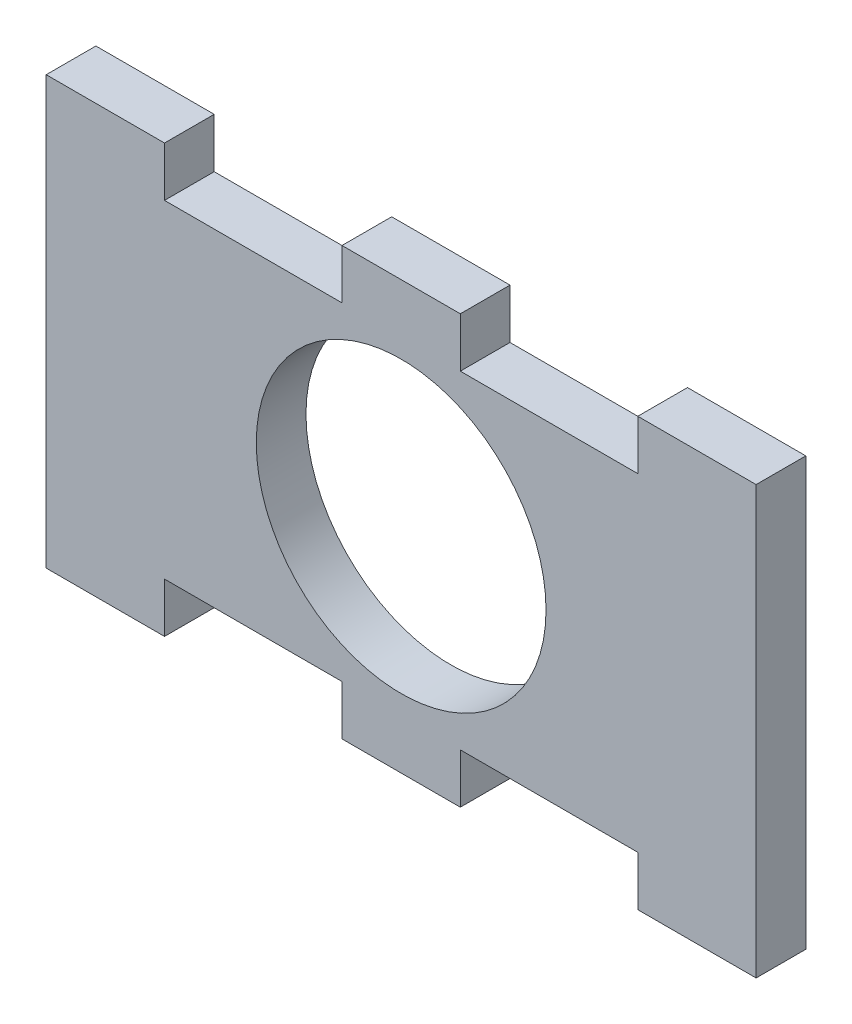
ISO-10303-21;
HEADER;
FILE_DESCRIPTION(('STEP AP214'),'2;1');
FILE_NAME('part.step','',(''),(''),'','','');
FILE_SCHEMA(('AUTOMOTIVE_DESIGN { 1 0 10303 214 1 1 1 1 }'));
ENDSEC;
DATA;
#1=APPLICATION_CONTEXT('core data for automotive mechanical design processes');
#2=APPLICATION_PROTOCOL_DEFINITION('international standard','automotive_design',2000,#1);
#3=PRODUCT_CONTEXT('',#1,'mechanical');
#4=PRODUCT('Part','Part','',(#3));
#5=PRODUCT_RELATED_PRODUCT_CATEGORY('part','',(#4));
#6=PRODUCT_DEFINITION_FORMATION('','',#4);
#7=PRODUCT_DEFINITION_CONTEXT('part definition',#1,'design');
#8=PRODUCT_DEFINITION('design','',#6,#7);
#9=PRODUCT_DEFINITION_SHAPE('','',#8);
#10=(LENGTH_UNIT() NAMED_UNIT(*) SI_UNIT(.MILLI.,.METRE.));
#11=(NAMED_UNIT(*) PLANE_ANGLE_UNIT() SI_UNIT($,.RADIAN.));
#12=(NAMED_UNIT(*) SI_UNIT($,.STERADIAN.) SOLID_ANGLE_UNIT());
#13=UNCERTAINTY_MEASURE_WITH_UNIT(LENGTH_MEASURE(1.E-05),#10,'distance_accuracy_value','');
#14=(GEOMETRIC_REPRESENTATION_CONTEXT(3) GLOBAL_UNCERTAINTY_ASSIGNED_CONTEXT((#13)) GLOBAL_UNIT_ASSIGNED_CONTEXT((#10,
#11,#12)) REPRESENTATION_CONTEXT('',''));
#15=CARTESIAN_POINT('',(0.,0.,0.));
#16=DIRECTION('',(0.,0.,1.));
#17=DIRECTION('',(1.,0.,0.));
#18=AXIS2_PLACEMENT_3D('',#15,#16,#17);
#19=CARTESIAN_POINT('',(-38.1,-17.6,-5.334));
#20=DIRECTION('',(0.,-1.,0.));
#21=DIRECTION('',(0.,0.,-1.));
#22=AXIS2_PLACEMENT_3D('',#19,#20,#21);
#23=PLANE('',#22);
#24=DIRECTION('',(1.,0.,0.));
#25=VECTOR('',#24,1.);
#26=CARTESIAN_POINT('',(-38.1,-17.6,-5.334));
#27=LINE('',#26,#25);
#28=CARTESIAN_POINT('',(6.35,-17.6,-5.334));
#29=VERTEX_POINT('',#28);
#30=CARTESIAN_POINT('',(25.4,-17.6,-5.334));
#31=VERTEX_POINT('',#30);
#32=EDGE_CURVE('E49',#29,#31,#27,.T.);
#33=ORIENTED_EDGE('',*,*,#32,.T.);
#34=DIRECTION('',(0.,0.,-1.));
#35=VECTOR('',#34,1.);
#36=CARTESIAN_POINT('',(25.4,-17.6,0.));
#37=LINE('',#36,#35);
#38=CARTESIAN_POINT('',(25.4,-17.6,0.));
#39=VERTEX_POINT('',#38);
#40=EDGE_CURVE('E204',#39,#31,#37,.T.);
#41=ORIENTED_EDGE('',*,*,#40,.F.);
#42=DIRECTION('',(1.,0.,0.));
#43=VECTOR('',#42,1.);
#44=CARTESIAN_POINT('',(-38.1,-17.6,0.));
#45=LINE('',#44,#43);
#46=CARTESIAN_POINT('',(6.35,-17.6,0.));
#47=VERTEX_POINT('',#46);
#48=EDGE_CURVE('E208',#47,#39,#45,.T.);
#49=ORIENTED_EDGE('',*,*,#48,.F.);
#50=DIRECTION('',(0.,0.,1.));
#51=VECTOR('',#50,1.);
#52=CARTESIAN_POINT('',(6.35,-17.6,0.));
#53=LINE('',#52,#51);
#54=EDGE_CURVE('E212',#29,#47,#53,.T.);
#55=ORIENTED_EDGE('',*,*,#54,.F.);
#56=EDGE_LOOP('',(#33,#41,#49,#55));
#57=FACE_BOUND('',#56,.T.);
#58=ADVANCED_FACE('F45',(#57),#23,.T.);
#59=CARTESIAN_POINT('',(-25.4,-17.6,-5.334));
#60=VERTEX_POINT('',#59);
#61=CARTESIAN_POINT('',(-6.35,-17.6,-5.334));
#62=VERTEX_POINT('',#61);
#63=EDGE_CURVE('E13',#60,#62,#27,.T.);
#64=ORIENTED_EDGE('',*,*,#63,.T.);
#65=DIRECTION('',(0.,0.,-1.));
#66=VECTOR('',#65,1.);
#67=CARTESIAN_POINT('',(-6.35,-17.6,0.));
#68=LINE('',#67,#66);
#69=CARTESIAN_POINT('',(-6.35,-17.6,0.));
#70=VERTEX_POINT('',#69);
#71=EDGE_CURVE('E209',#70,#62,#68,.T.);
#72=ORIENTED_EDGE('',*,*,#71,.F.);
#73=CARTESIAN_POINT('',(-25.4,-17.6,0.));
#74=VERTEX_POINT('',#73);
#75=EDGE_CURVE('E262',#74,#70,#45,.T.);
#76=ORIENTED_EDGE('',*,*,#75,.F.);
#77=DIRECTION('',(0.,0.,1.));
#78=VECTOR('',#77,1.);
#79=CARTESIAN_POINT('',(-25.4,-17.6,0.));
#80=LINE('',#79,#78);
#81=EDGE_CURVE('E69',#60,#74,#80,.T.);
#82=ORIENTED_EDGE('',*,*,#81,.F.);
#83=EDGE_LOOP('',(#64,#72,#76,#82));
#84=FACE_BOUND('',#83,.T.);
#85=ADVANCED_FACE('F394',(#84),#23,.T.);
#86=CARTESIAN_POINT('',(-38.1,17.6,-5.334));
#87=DIRECTION('',(0.,1.,0.));
#88=DIRECTION('',(0.,0.,1.));
#89=AXIS2_PLACEMENT_3D('',#86,#87,#88);
#90=PLANE('',#89);
#91=DIRECTION('',(-1.,0.,0.));
#92=VECTOR('',#91,1.);
#93=CARTESIAN_POINT('',(-38.1,17.6,0.));
#94=LINE('',#93,#92);
#95=CARTESIAN_POINT('',(25.4,17.6,0.));
#96=VERTEX_POINT('',#95);
#97=CARTESIAN_POINT('',(6.35000000000002,17.6,0.));
#98=VERTEX_POINT('',#97);
#99=EDGE_CURVE('E280',#96,#98,#94,.T.);
#100=ORIENTED_EDGE('',*,*,#99,.F.);
#101=DIRECTION('',(0.,0.,1.));
#102=VECTOR('',#101,1.);
#103=CARTESIAN_POINT('',(25.4,17.6,-5.33400000000004));
#104=LINE('',#103,#102);
#105=CARTESIAN_POINT('',(25.4,17.6,-5.33400000000004));
#106=VERTEX_POINT('',#105);
#107=EDGE_CURVE('E259',#106,#96,#104,.T.);
#108=ORIENTED_EDGE('',*,*,#107,.F.);
#109=DIRECTION('',(-1.,0.,0.));
#110=VECTOR('',#109,1.);
#111=CARTESIAN_POINT('',(-38.1,17.6,-5.334));
#112=LINE('',#111,#110);
#113=CARTESIAN_POINT('',(6.35000000000001,17.6,-5.33400000000002));
#114=VERTEX_POINT('',#113);
#115=EDGE_CURVE('E275',#106,#114,#112,.T.);
#116=ORIENTED_EDGE('',*,*,#115,.T.);
#117=DIRECTION('',(0.,0.,-1.));
#118=VECTOR('',#117,1.);
#119=CARTESIAN_POINT('',(6.35000000000001,17.6,-5.33400000000002));
#120=LINE('',#119,#118);
#121=EDGE_CURVE('E333',#98,#114,#120,.T.);
#122=ORIENTED_EDGE('',*,*,#121,.F.);
#123=EDGE_LOOP('',(#100,#108,#116,#122));
#124=FACE_BOUND('',#123,.T.);
#125=ADVANCED_FACE('F372',(#124),#90,.T.);
#126=CARTESIAN_POINT('',(-6.35000000000002,17.6,0.));
#127=VERTEX_POINT('',#126);
#128=CARTESIAN_POINT('',(-25.4,17.6,0.));
#129=VERTEX_POINT('',#128);
#130=EDGE_CURVE('E288',#127,#129,#94,.T.);
#131=ORIENTED_EDGE('',*,*,#130,.F.);
#132=DIRECTION('',(0.,0.,1.));
#133=VECTOR('',#132,1.);
#134=CARTESIAN_POINT('',(-6.35,17.6,-5.33400000000001));
#135=LINE('',#134,#133);
#136=CARTESIAN_POINT('',(-6.35,17.6,-5.33400000000001));
#137=VERTEX_POINT('',#136);
#138=EDGE_CURVE('E337',#137,#127,#135,.T.);
#139=ORIENTED_EDGE('',*,*,#138,.F.);
#140=CARTESIAN_POINT('',(-25.4,17.6,-5.334));
#141=VERTEX_POINT('',#140);
#142=EDGE_CURVE('E279',#137,#141,#112,.T.);
#143=ORIENTED_EDGE('',*,*,#142,.T.);
#144=DIRECTION('',(0.,0.,-1.));
#145=VECTOR('',#144,1.);
#146=CARTESIAN_POINT('',(-25.4,17.6,-5.334));
#147=LINE('',#146,#145);
#148=EDGE_CURVE('E268',#129,#141,#147,.T.);
#149=ORIENTED_EDGE('',*,*,#148,.F.);
#150=EDGE_LOOP('',(#131,#139,#143,#149));
#151=FACE_BOUND('',#150,.T.);
#152=ADVANCED_FACE('F412',(#151),#90,.T.);
#153=CARTESIAN_POINT('',(38.1,17.6,-5.334));
#154=DIRECTION('',(1.,0.,0.));
#155=DIRECTION('',(0.,0.,-1.));
#156=AXIS2_PLACEMENT_3D('',#153,#154,#155);
#157=PLANE('',#156);
#158=DIRECTION('',(0.,1.,0.));
#159=VECTOR('',#158,1.);
#160=CARTESIAN_POINT('',(38.1,17.6,0.));
#161=LINE('',#160,#159);
#162=CARTESIAN_POINT('',(38.1,-22.934,0.));
#163=VERTEX_POINT('',#162);
#164=CARTESIAN_POINT('',(38.1,22.934,0.));
#165=VERTEX_POINT('',#164);
#166=EDGE_CURVE('E290',#163,#165,#161,.T.);
#167=ORIENTED_EDGE('',*,*,#166,.F.);
#168=DIRECTION('',(0.,0.,1.));
#169=VECTOR('',#168,1.);
#170=CARTESIAN_POINT('',(38.1,-22.934,0.));
#171=LINE('',#170,#169);
#172=CARTESIAN_POINT('',(38.1,-22.934,-5.334));
#173=VERTEX_POINT('',#172);
#174=EDGE_CURVE('E203',#173,#163,#171,.T.);
#175=ORIENTED_EDGE('',*,*,#174,.F.);
#176=DIRECTION('',(0.,1.,0.));
#177=VECTOR('',#176,1.);
#178=CARTESIAN_POINT('',(38.1,17.6,-5.334));
#179=LINE('',#178,#177);
#180=CARTESIAN_POINT('',(38.1,22.934,-5.33400000000006));
#181=VERTEX_POINT('',#180);
#182=EDGE_CURVE('E274',#173,#181,#179,.T.);
#183=ORIENTED_EDGE('',*,*,#182,.T.);
#184=DIRECTION('',(0.,0.,-1.));
#185=VECTOR('',#184,1.);
#186=CARTESIAN_POINT('',(38.1,22.934,-5.33400000000006));
#187=LINE('',#186,#185);
#188=EDGE_CURVE('E350',#165,#181,#187,.T.);
#189=ORIENTED_EDGE('',*,*,#188,.F.);
#190=EDGE_LOOP('',(#167,#175,#183,#189));
#191=FACE_BOUND('',#190,.T.);
#192=ADVANCED_FACE('F47',(#191),#157,.T.);
#193=CARTESIAN_POINT('',(-38.1,17.6,-5.334));
#194=DIRECTION('',(-1.,0.,0.));
#195=DIRECTION('',(0.,-1.,0.));
#196=AXIS2_PLACEMENT_3D('',#193,#194,#195);
#197=PLANE('',#196);
#198=DIRECTION('',(0.,-1.,0.));
#199=VECTOR('',#198,1.);
#200=CARTESIAN_POINT('',(-38.1,17.6,0.));
#201=LINE('',#200,#199);
#202=CARTESIAN_POINT('',(-38.1,22.934,0.));
#203=VERTEX_POINT('',#202);
#204=CARTESIAN_POINT('',(-38.1,-22.934,0.));
#205=VERTEX_POINT('',#204);
#206=EDGE_CURVE('E263',#203,#205,#201,.T.);
#207=ORIENTED_EDGE('',*,*,#206,.F.);
#208=DIRECTION('',(0.,0.,1.));
#209=VECTOR('',#208,1.);
#210=CARTESIAN_POINT('',(-38.1,22.934,-5.334));
#211=LINE('',#210,#209);
#212=CARTESIAN_POINT('',(-38.1,22.934,-5.334));
#213=VERTEX_POINT('',#212);
#214=EDGE_CURVE('E318',#213,#203,#211,.T.);
#215=ORIENTED_EDGE('',*,*,#214,.F.);
#216=DIRECTION('',(0.,-1.,0.));
#217=VECTOR('',#216,1.);
#218=CARTESIAN_POINT('',(-38.1,17.6,-5.334));
#219=LINE('',#218,#217);
#220=CARTESIAN_POINT('',(-38.1,-22.934,-5.334));
#221=VERTEX_POINT('',#220);
#222=EDGE_CURVE('E278',#213,#221,#219,.T.);
#223=ORIENTED_EDGE('',*,*,#222,.T.);
#224=DIRECTION('',(0.,0.,-1.));
#225=VECTOR('',#224,1.);
#226=CARTESIAN_POINT('',(-38.1,-22.934,0.));
#227=LINE('',#226,#225);
#228=EDGE_CURVE('E234',#205,#221,#227,.T.);
#229=ORIENTED_EDGE('',*,*,#228,.F.);
#230=EDGE_LOOP('',(#207,#215,#223,#229));
#231=FACE_BOUND('',#230,.T.);
#232=ADVANCED_FACE('F385',(#231),#197,.T.);
#233=CARTESIAN_POINT('',(0.,0.,-5.334));
#234=DIRECTION('',(0.,0.,1.));
#235=DIRECTION('',(1.,0.,0.));
#236=AXIS2_PLACEMENT_3D('',#233,#234,#235);
#237=PLANE('',#236);
#238=CARTESIAN_POINT('',(0.,0.,-5.334));
#239=DIRECTION('',(0.,0.,1.));
#240=DIRECTION('',(1.,0.,0.));
#241=AXIS2_PLACEMENT_3D('',#238,#239,#240);
#242=CIRCLE('',#241,15.55);
#243=CARTESIAN_POINT('',(15.55,0.,-5.334));
#244=VERTEX_POINT('',#243);
#245=EDGE_CURVE('E296',#244,#244,#242,.T.);
#246=ORIENTED_EDGE('',*,*,#245,.T.);
#247=EDGE_LOOP('',(#246));
#248=FACE_BOUND('',#247,.T.);
#249=ORIENTED_EDGE('',*,*,#182,.F.);
#250=DIRECTION('',(1.,0.,0.));
#251=VECTOR('',#250,1.);
#252=CARTESIAN_POINT('',(38.1,-22.934,-5.334));
#253=LINE('',#252,#251);
#254=CARTESIAN_POINT('',(25.4,-22.934,-5.334));
#255=VERTEX_POINT('',#254);
#256=EDGE_CURVE('E196',#255,#173,#253,.T.);
#257=ORIENTED_EDGE('',*,*,#256,.F.);
#258=DIRECTION('',(0.,1.,0.));
#259=VECTOR('',#258,1.);
#260=CARTESIAN_POINT('',(25.4,-22.934,-5.334));
#261=LINE('',#260,#259);
#262=EDGE_CURVE('E192',#255,#31,#261,.T.);
#263=ORIENTED_EDGE('',*,*,#262,.T.);
#264=ORIENTED_EDGE('',*,*,#32,.F.);
#265=DIRECTION('',(0.,1.,0.));
#266=VECTOR('',#265,1.);
#267=CARTESIAN_POINT('',(6.35,-22.934,-5.334));
#268=LINE('',#267,#266);
#269=CARTESIAN_POINT('',(6.35,-22.934,-5.334));
#270=VERTEX_POINT('',#269);
#271=EDGE_CURVE('E230',#270,#29,#268,.T.);
#272=ORIENTED_EDGE('',*,*,#271,.F.);
#273=DIRECTION('',(1.,0.,0.));
#274=VECTOR('',#273,1.);
#275=CARTESIAN_POINT('',(6.35,-22.934,-5.334));
#276=LINE('',#275,#274);
#277=CARTESIAN_POINT('',(-6.35,-22.934,-5.334));
#278=VERTEX_POINT('',#277);
#279=EDGE_CURVE('E220',#278,#270,#276,.T.);
#280=ORIENTED_EDGE('',*,*,#279,.F.);
#281=DIRECTION('',(0.,1.,0.));
#282=VECTOR('',#281,1.);
#283=CARTESIAN_POINT('',(-6.35,-22.934,-5.334));
#284=LINE('',#283,#282);
#285=EDGE_CURVE('E232',#278,#62,#284,.T.);
#286=ORIENTED_EDGE('',*,*,#285,.T.);
#287=ORIENTED_EDGE('',*,*,#63,.F.);
#288=DIRECTION('',(0.,1.,0.));
#289=VECTOR('',#288,1.);
#290=CARTESIAN_POINT('',(-25.4,-22.934,-5.334));
#291=LINE('',#290,#289);
#292=CARTESIAN_POINT('',(-25.4,-22.934,-5.334));
#293=VERTEX_POINT('',#292);
#294=EDGE_CURVE('E254',#293,#60,#291,.T.);
#295=ORIENTED_EDGE('',*,*,#294,.F.);
#296=DIRECTION('',(1.,0.,0.));
#297=VECTOR('',#296,1.);
#298=CARTESIAN_POINT('',(-38.1,-22.934,-5.334));
#299=LINE('',#298,#297);
#300=EDGE_CURVE('E237',#221,#293,#299,.T.);
#301=ORIENTED_EDGE('',*,*,#300,.F.);
#302=ORIENTED_EDGE('',*,*,#222,.F.);
#303=DIRECTION('',(-1.,0.,0.));
#304=VECTOR('',#303,1.);
#305=CARTESIAN_POINT('',(-38.1,22.934,-5.334));
#306=LINE('',#305,#304);
#307=CARTESIAN_POINT('',(-25.4,22.934,-5.334));
#308=VERTEX_POINT('',#307);
#309=EDGE_CURVE('E310',#308,#213,#306,.T.);
#310=ORIENTED_EDGE('',*,*,#309,.F.);
#311=DIRECTION('',(0.,-1.,0.));
#312=VECTOR('',#311,1.);
#313=CARTESIAN_POINT('',(-25.4,22.934,-5.334));
#314=LINE('',#313,#312);
#315=EDGE_CURVE('E313',#308,#141,#314,.T.);
#316=ORIENTED_EDGE('',*,*,#315,.T.);
#317=ORIENTED_EDGE('',*,*,#142,.F.);
#318=DIRECTION('',(0.,-1.,0.));
#319=VECTOR('',#318,1.);
#320=CARTESIAN_POINT('',(-6.35,22.934,-5.33400000000001));
#321=LINE('',#320,#319);
#322=CARTESIAN_POINT('',(-6.35,22.934,-5.33400000000001));
#323=VERTEX_POINT('',#322);
#324=EDGE_CURVE('E330',#323,#137,#321,.T.);
#325=ORIENTED_EDGE('',*,*,#324,.F.);
#326=DIRECTION('',(-1.,0.,0.));
#327=VECTOR('',#326,1.);
#328=CARTESIAN_POINT('',(6.35000000000001,22.934,-5.33400000000002));
#329=LINE('',#328,#327);
#330=CARTESIAN_POINT('',(6.35000000000001,22.934,-5.33400000000002));
#331=VERTEX_POINT('',#330);
#332=EDGE_CURVE('E332',#331,#323,#329,.T.);
#333=ORIENTED_EDGE('',*,*,#332,.F.);
#334=DIRECTION('',(0.,-1.,0.));
#335=VECTOR('',#334,1.);
#336=CARTESIAN_POINT('',(6.35000000000001,22.934,-5.33400000000002));
#337=LINE('',#336,#335);
#338=EDGE_CURVE('E327',#331,#114,#337,.T.);
#339=ORIENTED_EDGE('',*,*,#338,.T.);
#340=ORIENTED_EDGE('',*,*,#115,.F.);
#341=DIRECTION('',(0.,-1.,0.));
#342=VECTOR('',#341,1.);
#343=CARTESIAN_POINT('',(25.4,22.934,-5.33400000000004));
#344=LINE('',#343,#342);
#345=CARTESIAN_POINT('',(25.4,22.934,-5.33400000000004));
#346=VERTEX_POINT('',#345);
#347=EDGE_CURVE('E339',#346,#106,#344,.T.);
#348=ORIENTED_EDGE('',*,*,#347,.F.);
#349=DIRECTION('',(-1.,0.,0.));
#350=VECTOR('',#349,1.);
#351=CARTESIAN_POINT('',(38.1,22.934,-5.33400000000006));
#352=LINE('',#351,#350);
#353=EDGE_CURVE('E247',#181,#346,#352,.T.);
#354=ORIENTED_EDGE('',*,*,#353,.F.);
#355=EDGE_LOOP('',(#249,#257,#263,#264,#272,#280,#286,#287,#295,#301,#302,#310,#316,#317,#325,
#333,#339,#340,#348,#354));
#356=FACE_BOUND('',#355,.T.);
#357=ADVANCED_FACE('F366',(#248,#356),#237,.F.);
#358=CARTESIAN_POINT('',(0.,0.,0.));
#359=DIRECTION('',(0.,0.,1.));
#360=DIRECTION('',(1.,0.,0.));
#361=AXIS2_PLACEMENT_3D('',#358,#359,#360);
#362=PLANE('',#361);
#363=CARTESIAN_POINT('',(0.,0.,0.));
#364=DIRECTION('',(0.,0.,1.));
#365=DIRECTION('',(1.,0.,0.));
#366=AXIS2_PLACEMENT_3D('',#363,#364,#365);
#367=CIRCLE('',#366,15.55);
#368=CARTESIAN_POINT('',(15.55,0.,0.));
#369=VERTEX_POINT('',#368);
#370=EDGE_CURVE('E302',#369,#369,#367,.T.);
#371=ORIENTED_EDGE('',*,*,#370,.F.);
#372=EDGE_LOOP('',(#371));
#373=FACE_BOUND('',#372,.T.);
#374=ORIENTED_EDGE('',*,*,#166,.T.);
#375=DIRECTION('',(1.,0.,0.));
#376=VECTOR('',#375,1.);
#377=CARTESIAN_POINT('',(38.1,22.934,0.));
#378=LINE('',#377,#376);
#379=CARTESIAN_POINT('',(25.4,22.934,0.));
#380=VERTEX_POINT('',#379);
#381=EDGE_CURVE('E355',#380,#165,#378,.T.);
#382=ORIENTED_EDGE('',*,*,#381,.F.);
#383=DIRECTION('',(0.,-1.,0.));
#384=VECTOR('',#383,1.);
#385=CARTESIAN_POINT('',(25.4,22.934,0.));
#386=LINE('',#385,#384);
#387=EDGE_CURVE('E348',#380,#96,#386,.T.);
#388=ORIENTED_EDGE('',*,*,#387,.T.);
#389=ORIENTED_EDGE('',*,*,#99,.T.);
#390=DIRECTION('',(0.,-1.,0.));
#391=VECTOR('',#390,1.);
#392=CARTESIAN_POINT('',(6.35000000000002,22.934,0.));
#393=LINE('',#392,#391);
#394=CARTESIAN_POINT('',(6.35000000000002,22.934,0.));
#395=VERTEX_POINT('',#394);
#396=EDGE_CURVE('E324',#395,#98,#393,.T.);
#397=ORIENTED_EDGE('',*,*,#396,.F.);
#398=DIRECTION('',(1.,0.,0.));
#399=VECTOR('',#398,1.);
#400=CARTESIAN_POINT('',(6.35000000000002,22.934,0.));
#401=LINE('',#400,#399);
#402=CARTESIAN_POINT('',(-6.35,22.934,0.));
#403=VERTEX_POINT('',#402);
#404=EDGE_CURVE('E343',#403,#395,#401,.T.);
#405=ORIENTED_EDGE('',*,*,#404,.F.);
#406=DIRECTION('',(0.,-1.,0.));
#407=VECTOR('',#406,1.);
#408=CARTESIAN_POINT('',(-6.35,22.934,0.));
#409=LINE('',#408,#407);
#410=EDGE_CURVE('E321',#403,#127,#409,.T.);
#411=ORIENTED_EDGE('',*,*,#410,.T.);
#412=ORIENTED_EDGE('',*,*,#130,.T.);
#413=DIRECTION('',(0.,-1.,0.));
#414=VECTOR('',#413,1.);
#415=CARTESIAN_POINT('',(-25.4,22.934,0.));
#416=LINE('',#415,#414);
#417=CARTESIAN_POINT('',(-25.4,22.934,0.));
#418=VERTEX_POINT('',#417);
#419=EDGE_CURVE('E307',#418,#129,#416,.T.);
#420=ORIENTED_EDGE('',*,*,#419,.F.);
#421=DIRECTION('',(1.,0.,0.));
#422=VECTOR('',#421,1.);
#423=CARTESIAN_POINT('',(-38.1,22.934,0.));
#424=LINE('',#423,#422);
#425=EDGE_CURVE('E316',#203,#418,#424,.T.);
#426=ORIENTED_EDGE('',*,*,#425,.F.);
#427=ORIENTED_EDGE('',*,*,#206,.T.);
#428=DIRECTION('',(-1.,0.,0.));
#429=VECTOR('',#428,1.);
#430=CARTESIAN_POINT('',(-38.1,-22.934,0.));
#431=LINE('',#430,#429);
#432=CARTESIAN_POINT('',(-25.4,-22.934,0.));
#433=VERTEX_POINT('',#432);
#434=EDGE_CURVE('E241',#433,#205,#431,.T.);
#435=ORIENTED_EDGE('',*,*,#434,.F.);
#436=DIRECTION('',(0.,1.,0.));
#437=VECTOR('',#436,1.);
#438=CARTESIAN_POINT('',(-25.4,-22.934,0.));
#439=LINE('',#438,#437);
#440=EDGE_CURVE('E244',#433,#74,#439,.T.);
#441=ORIENTED_EDGE('',*,*,#440,.T.);
#442=ORIENTED_EDGE('',*,*,#75,.T.);
#443=DIRECTION('',(0.,1.,0.));
#444=VECTOR('',#443,1.);
#445=CARTESIAN_POINT('',(-6.35,-22.934,0.));
#446=LINE('',#445,#444);
#447=CARTESIAN_POINT('',(-6.35,-22.934,0.));
#448=VERTEX_POINT('',#447);
#449=EDGE_CURVE('E225',#448,#70,#446,.T.);
#450=ORIENTED_EDGE('',*,*,#449,.F.);
#451=DIRECTION('',(-1.,0.,0.));
#452=VECTOR('',#451,1.);
#453=CARTESIAN_POINT('',(6.35,-22.934,0.));
#454=LINE('',#453,#452);
#455=CARTESIAN_POINT('',(6.35,-22.934,0.));
#456=VERTEX_POINT('',#455);
#457=EDGE_CURVE('E224',#456,#448,#454,.T.);
#458=ORIENTED_EDGE('',*,*,#457,.F.);
#459=DIRECTION('',(0.,1.,0.));
#460=VECTOR('',#459,1.);
#461=CARTESIAN_POINT('',(6.35,-22.934,0.));
#462=LINE('',#461,#460);
#463=EDGE_CURVE('E62',#456,#47,#462,.T.);
#464=ORIENTED_EDGE('',*,*,#463,.T.);
#465=ORIENTED_EDGE('',*,*,#48,.T.);
#466=DIRECTION('',(0.,1.,0.));
#467=VECTOR('',#466,1.);
#468=CARTESIAN_POINT('',(25.4,-22.934,0.));
#469=LINE('',#468,#467);
#470=CARTESIAN_POINT('',(25.4,-22.934,0.));
#471=VERTEX_POINT('',#470);
#472=EDGE_CURVE('E189',#471,#39,#469,.T.);
#473=ORIENTED_EDGE('',*,*,#472,.F.);
#474=DIRECTION('',(-1.,0.,0.));
#475=VECTOR('',#474,1.);
#476=CARTESIAN_POINT('',(38.1,-22.934,0.));
#477=LINE('',#476,#475);
#478=EDGE_CURVE('E197',#163,#471,#477,.T.);
#479=ORIENTED_EDGE('',*,*,#478,.F.);
#480=EDGE_LOOP('',(#374,#382,#388,#389,#397,#405,#411,#412,#420,#426,#427,#435,#441,#442,#450,
#458,#464,#465,#473,#479));
#481=FACE_BOUND('',#480,.T.);
#482=ADVANCED_FACE('F206',(#373,#481),#362,.T.);
#483=CARTESIAN_POINT('',(0.,0.,-5.334));
#484=DIRECTION('',(0.,0.,1.));
#485=DIRECTION('',(1.,0.,0.));
#486=AXIS2_PLACEMENT_3D('',#483,#484,#485);
#487=CYLINDRICAL_SURFACE('',#486,15.55);
#488=ORIENTED_EDGE('',*,*,#245,.F.);
#489=EDGE_LOOP('',(#488));
#490=FACE_BOUND('',#489,.T.);
#491=ORIENTED_EDGE('',*,*,#370,.T.);
#492=EDGE_LOOP('',(#491));
#493=FACE_BOUND('',#492,.T.);
#494=ADVANCED_FACE('F428',(#490,#493),#487,.F.);
#495=CARTESIAN_POINT('',(-25.4,22.934,-5.334));
#496=DIRECTION('',(-1.,0.,0.));
#497=DIRECTION('',(0.,0.,1.));
#498=AXIS2_PLACEMENT_3D('',#495,#496,#497);
#499=PLANE('',#498);
#500=ORIENTED_EDGE('',*,*,#148,.T.);
#501=ORIENTED_EDGE('',*,*,#315,.F.);
#502=DIRECTION('',(0.,0.,-1.));
#503=VECTOR('',#502,1.);
#504=CARTESIAN_POINT('',(-25.4,22.934,-5.334));
#505=LINE('',#504,#503);
#506=EDGE_CURVE('E314',#418,#308,#505,.T.);
#507=ORIENTED_EDGE('',*,*,#506,.F.);
#508=ORIENTED_EDGE('',*,*,#419,.T.);
#509=EDGE_LOOP('',(#500,#501,#507,#508));
#510=FACE_BOUND('',#509,.T.);
#511=ADVANCED_FACE('F434',(#510),#499,.F.);
#512=CARTESIAN_POINT('',(0.,22.934,0.));
#513=DIRECTION('',(0.,1.,0.));
#514=DIRECTION('',(0.,0.,1.));
#515=AXIS2_PLACEMENT_3D('',#512,#513,#514);
#516=PLANE('',#515);
#517=ORIENTED_EDGE('',*,*,#214,.T.);
#518=ORIENTED_EDGE('',*,*,#425,.T.);
#519=ORIENTED_EDGE('',*,*,#506,.T.);
#520=ORIENTED_EDGE('',*,*,#309,.T.);
#521=EDGE_LOOP('',(#517,#518,#519,#520));
#522=FACE_BOUND('',#521,.T.);
#523=ADVANCED_FACE('F438',(#522),#516,.T.);
#524=CARTESIAN_POINT('',(-6.35,22.934,-5.33400000000001));
#525=DIRECTION('',(1.,0.,0.));
#526=DIRECTION('',(0.,0.,-1.));
#527=AXIS2_PLACEMENT_3D('',#524,#525,#526);
#528=PLANE('',#527);
#529=ORIENTED_EDGE('',*,*,#138,.T.);
#530=ORIENTED_EDGE('',*,*,#410,.F.);
#531=DIRECTION('',(0.,0.,1.));
#532=VECTOR('',#531,1.);
#533=CARTESIAN_POINT('',(-6.35,22.934,-5.33400000000001));
#534=LINE('',#533,#532);
#535=EDGE_CURVE('E336',#323,#403,#534,.T.);
#536=ORIENTED_EDGE('',*,*,#535,.F.);
#537=ORIENTED_EDGE('',*,*,#324,.T.);
#538=EDGE_LOOP('',(#529,#530,#536,#537));
#539=FACE_BOUND('',#538,.T.);
#540=ADVANCED_FACE('F442',(#539),#528,.F.);
#541=CARTESIAN_POINT('',(6.35000000000001,22.934,-5.33400000000002));
#542=DIRECTION('',(-1.,0.,0.));
#543=DIRECTION('',(0.,0.,1.));
#544=AXIS2_PLACEMENT_3D('',#541,#542,#543);
#545=PLANE('',#544);
#546=ORIENTED_EDGE('',*,*,#121,.T.);
#547=ORIENTED_EDGE('',*,*,#338,.F.);
#548=DIRECTION('',(0.,0.,-1.));
#549=VECTOR('',#548,1.);
#550=CARTESIAN_POINT('',(6.35000000000001,22.934,-5.33400000000002));
#551=LINE('',#550,#549);
#552=EDGE_CURVE('E341',#395,#331,#551,.T.);
#553=ORIENTED_EDGE('',*,*,#552,.F.);
#554=ORIENTED_EDGE('',*,*,#396,.T.);
#555=EDGE_LOOP('',(#546,#547,#553,#554));
#556=FACE_BOUND('',#555,.T.);
#557=ADVANCED_FACE('F446',(#556),#545,.F.);
#558=CARTESIAN_POINT('',(0.,22.934,0.));
#559=DIRECTION('',(0.,-1.,0.));
#560=DIRECTION('',(0.,0.,-1.));
#561=AXIS2_PLACEMENT_3D('',#558,#559,#560);
#562=PLANE('',#561);
#563=ORIENTED_EDGE('',*,*,#535,.T.);
#564=ORIENTED_EDGE('',*,*,#404,.T.);
#565=ORIENTED_EDGE('',*,*,#552,.T.);
#566=ORIENTED_EDGE('',*,*,#332,.T.);
#567=EDGE_LOOP('',(#563,#564,#565,#566));
#568=FACE_BOUND('',#567,.T.);
#569=ADVANCED_FACE('F450',(#568),#562,.F.);
#570=CARTESIAN_POINT('',(25.4,22.934,-5.33400000000004));
#571=DIRECTION('',(1.,0.,0.));
#572=DIRECTION('',(0.,0.,-1.));
#573=AXIS2_PLACEMENT_3D('',#570,#571,#572);
#574=PLANE('',#573);
#575=ORIENTED_EDGE('',*,*,#107,.T.);
#576=ORIENTED_EDGE('',*,*,#387,.F.);
#577=DIRECTION('',(0.,0.,1.));
#578=VECTOR('',#577,1.);
#579=CARTESIAN_POINT('',(25.4,22.934,-5.33400000000004));
#580=LINE('',#579,#578);
#581=EDGE_CURVE('E356',#346,#380,#580,.T.);
#582=ORIENTED_EDGE('',*,*,#581,.F.);
#583=ORIENTED_EDGE('',*,*,#347,.T.);
#584=EDGE_LOOP('',(#575,#576,#582,#583));
#585=FACE_BOUND('',#584,.T.);
#586=ADVANCED_FACE('F369',(#585),#574,.F.);
#587=CARTESIAN_POINT('',(0.,22.934,0.));
#588=DIRECTION('',(0.,1.,0.));
#589=DIRECTION('',(0.,0.,1.));
#590=AXIS2_PLACEMENT_3D('',#587,#588,#589);
#591=PLANE('',#590);
#592=ORIENTED_EDGE('',*,*,#353,.T.);
#593=ORIENTED_EDGE('',*,*,#581,.T.);
#594=ORIENTED_EDGE('',*,*,#381,.T.);
#595=ORIENTED_EDGE('',*,*,#188,.T.);
#596=EDGE_LOOP('',(#592,#593,#594,#595));
#597=FACE_BOUND('',#596,.T.);
#598=ADVANCED_FACE('F362',(#597),#591,.T.);
#599=CARTESIAN_POINT('',(-25.4,-22.934,0.));
#600=DIRECTION('',(-1.,0.,0.));
#601=DIRECTION('',(0.,0.,1.));
#602=AXIS2_PLACEMENT_3D('',#599,#600,#601);
#603=PLANE('',#602);
#604=ORIENTED_EDGE('',*,*,#81,.T.);
#605=ORIENTED_EDGE('',*,*,#440,.F.);
#606=DIRECTION('',(0.,0.,1.));
#607=VECTOR('',#606,1.);
#608=CARTESIAN_POINT('',(-25.4,-22.934,0.));
#609=LINE('',#608,#607);
#610=EDGE_CURVE('E239',#293,#433,#609,.T.);
#611=ORIENTED_EDGE('',*,*,#610,.F.);
#612=ORIENTED_EDGE('',*,*,#294,.T.);
#613=EDGE_LOOP('',(#604,#605,#611,#612));
#614=FACE_BOUND('',#613,.T.);
#615=ADVANCED_FACE('F390',(#614),#603,.F.);
#616=CARTESIAN_POINT('',(0.,-22.934,0.));
#617=DIRECTION('',(0.,-1.,0.));
#618=DIRECTION('',(0.,0.,-1.));
#619=AXIS2_PLACEMENT_3D('',#616,#617,#618);
#620=PLANE('',#619);
#621=ORIENTED_EDGE('',*,*,#228,.T.);
#622=ORIENTED_EDGE('',*,*,#300,.T.);
#623=ORIENTED_EDGE('',*,*,#610,.T.);
#624=ORIENTED_EDGE('',*,*,#434,.T.);
#625=EDGE_LOOP('',(#621,#622,#623,#624));
#626=FACE_BOUND('',#625,.T.);
#627=ADVANCED_FACE('F382',(#626),#620,.T.);
#628=CARTESIAN_POINT('',(-6.35,-22.934,0.));
#629=DIRECTION('',(1.,0.,0.));
#630=DIRECTION('',(0.,0.,-1.));
#631=AXIS2_PLACEMENT_3D('',#628,#629,#630);
#632=PLANE('',#631);
#633=ORIENTED_EDGE('',*,*,#71,.T.);
#634=ORIENTED_EDGE('',*,*,#285,.F.);
#635=DIRECTION('',(0.,0.,-1.));
#636=VECTOR('',#635,1.);
#637=CARTESIAN_POINT('',(-6.35,-22.934,0.));
#638=LINE('',#637,#636);
#639=EDGE_CURVE('E217',#448,#278,#638,.T.);
#640=ORIENTED_EDGE('',*,*,#639,.F.);
#641=ORIENTED_EDGE('',*,*,#449,.T.);
#642=EDGE_LOOP('',(#633,#634,#640,#641));
#643=FACE_BOUND('',#642,.T.);
#644=ADVANCED_FACE('F397',(#643),#632,.F.);
#645=CARTESIAN_POINT('',(6.35,-22.934,0.));
#646=DIRECTION('',(-1.,0.,0.));
#647=DIRECTION('',(0.,0.,1.));
#648=AXIS2_PLACEMENT_3D('',#645,#646,#647);
#649=PLANE('',#648);
#650=ORIENTED_EDGE('',*,*,#54,.T.);
#651=ORIENTED_EDGE('',*,*,#463,.F.);
#652=DIRECTION('',(0.,0.,1.));
#653=VECTOR('',#652,1.);
#654=CARTESIAN_POINT('',(6.35,-22.934,0.));
#655=LINE('',#654,#653);
#656=EDGE_CURVE('E222',#270,#456,#655,.T.);
#657=ORIENTED_EDGE('',*,*,#656,.F.);
#658=ORIENTED_EDGE('',*,*,#271,.T.);
#659=EDGE_LOOP('',(#650,#651,#657,#658));
#660=FACE_BOUND('',#659,.T.);
#661=ADVANCED_FACE('F403',(#660),#649,.F.);
#662=CARTESIAN_POINT('',(0.,-22.934,0.));
#663=DIRECTION('',(0.,1.,0.));
#664=DIRECTION('',(0.,0.,1.));
#665=AXIS2_PLACEMENT_3D('',#662,#663,#664);
#666=PLANE('',#665);
#667=ORIENTED_EDGE('',*,*,#639,.T.);
#668=ORIENTED_EDGE('',*,*,#279,.T.);
#669=ORIENTED_EDGE('',*,*,#656,.T.);
#670=ORIENTED_EDGE('',*,*,#457,.T.);
#671=EDGE_LOOP('',(#667,#668,#669,#670));
#672=FACE_BOUND('',#671,.T.);
#673=ADVANCED_FACE('F399',(#672),#666,.F.);
#674=CARTESIAN_POINT('',(25.4,-22.934,0.));
#675=DIRECTION('',(1.,0.,0.));
#676=DIRECTION('',(0.,0.,-1.));
#677=AXIS2_PLACEMENT_3D('',#674,#675,#676);
#678=PLANE('',#677);
#679=ORIENTED_EDGE('',*,*,#40,.T.);
#680=ORIENTED_EDGE('',*,*,#262,.F.);
#681=DIRECTION('',(0.,0.,-1.));
#682=VECTOR('',#681,1.);
#683=CARTESIAN_POINT('',(25.4,-22.934,0.));
#684=LINE('',#683,#682);
#685=EDGE_CURVE('E185',#471,#255,#684,.T.);
#686=ORIENTED_EDGE('',*,*,#685,.F.);
#687=ORIENTED_EDGE('',*,*,#472,.T.);
#688=EDGE_LOOP('',(#679,#680,#686,#687));
#689=FACE_BOUND('',#688,.T.);
#690=ADVANCED_FACE('F187',(#689),#678,.F.);
#691=CARTESIAN_POINT('',(0.,-22.934,0.));
#692=DIRECTION('',(0.,-1.,0.));
#693=DIRECTION('',(0.,0.,-1.));
#694=AXIS2_PLACEMENT_3D('',#691,#692,#693);
#695=PLANE('',#694);
#696=ORIENTED_EDGE('',*,*,#478,.T.);
#697=ORIENTED_EDGE('',*,*,#685,.T.);
#698=ORIENTED_EDGE('',*,*,#256,.T.);
#699=ORIENTED_EDGE('',*,*,#174,.T.);
#700=EDGE_LOOP('',(#696,#697,#698,#699));
#701=FACE_BOUND('',#700,.T.);
#702=ADVANCED_FACE('F201',(#701),#695,.T.);
#703=CLOSED_SHELL('',(#58,#85,#125,#152,#192,#232,#357,#482,#494,#511,#523,#540,#557,#569,#586,
#598,#615,#627,#644,#661,#673,#690,#702));
#704=MANIFOLD_SOLID_BREP('B2',#703);
#705=ADVANCED_BREP_SHAPE_REPRESENTATION('',(#18,#704),#14);
#706=SHAPE_DEFINITION_REPRESENTATION(#9,#705);
ENDSEC;
END-ISO-10303-21;
